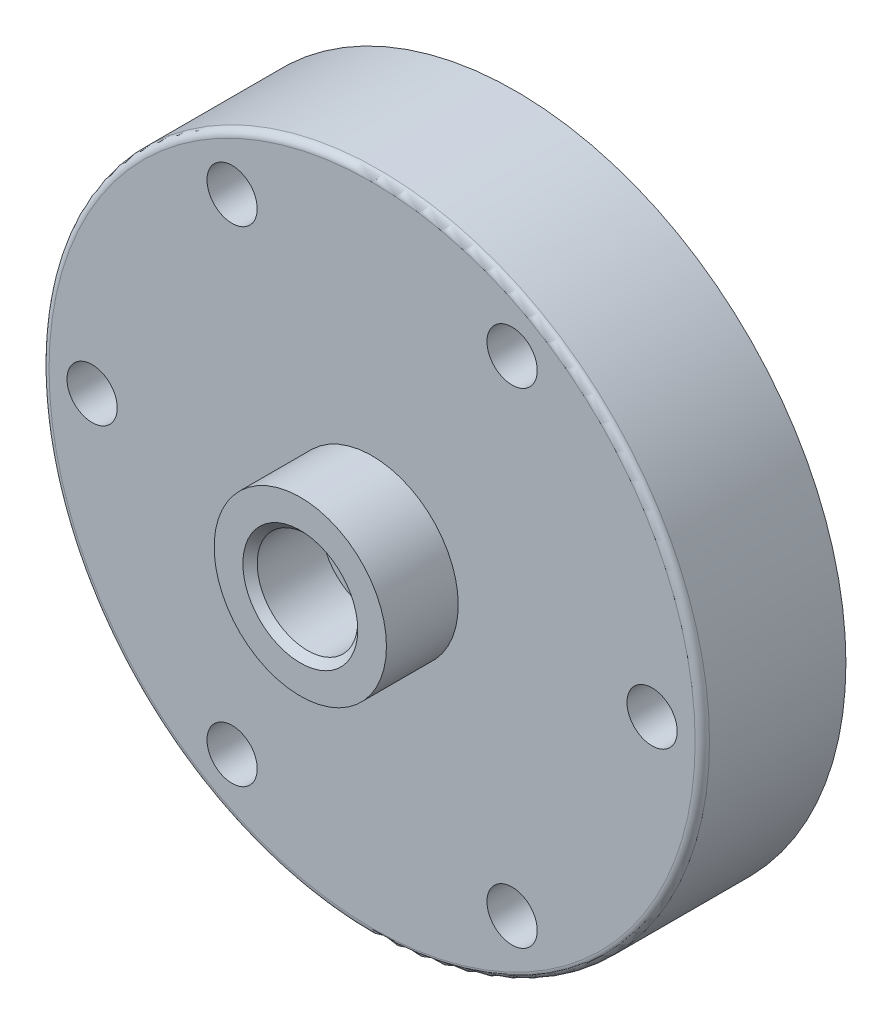
ISO-10303-21;
HEADER;
FILE_DESCRIPTION(('STEP AP214'),'2;1');
FILE_NAME('part.step','',(''),(''),'','','');
FILE_SCHEMA(('AUTOMOTIVE_DESIGN { 1 0 10303 214 1 1 1 1 }'));
ENDSEC;
DATA;
#1=APPLICATION_CONTEXT('core data for automotive mechanical design processes');
#2=APPLICATION_PROTOCOL_DEFINITION('international standard','automotive_design',2000,#1);
#3=PRODUCT_CONTEXT('',#1,'mechanical');
#4=PRODUCT('Part','Part','',(#3));
#5=PRODUCT_RELATED_PRODUCT_CATEGORY('part','',(#4));
#6=PRODUCT_DEFINITION_FORMATION('','',#4);
#7=PRODUCT_DEFINITION_CONTEXT('part definition',#1,'design');
#8=PRODUCT_DEFINITION('design','',#6,#7);
#9=PRODUCT_DEFINITION_SHAPE('','',#8);
#10=(LENGTH_UNIT() NAMED_UNIT(*) SI_UNIT(.MILLI.,.METRE.));
#11=(NAMED_UNIT(*) PLANE_ANGLE_UNIT() SI_UNIT($,.RADIAN.));
#12=(NAMED_UNIT(*) SI_UNIT($,.STERADIAN.) SOLID_ANGLE_UNIT());
#13=UNCERTAINTY_MEASURE_WITH_UNIT(LENGTH_MEASURE(1.E-05),#10,'distance_accuracy_value','');
#14=(GEOMETRIC_REPRESENTATION_CONTEXT(3) GLOBAL_UNCERTAINTY_ASSIGNED_CONTEXT((#13)) GLOBAL_UNIT_ASSIGNED_CONTEXT((#10,
#11,#12)) REPRESENTATION_CONTEXT('',''));
#15=CARTESIAN_POINT('',(0.,0.,0.));
#16=DIRECTION('',(0.,0.,1.));
#17=DIRECTION('',(1.,0.,0.));
#18=AXIS2_PLACEMENT_3D('',#15,#16,#17);
#19=CARTESIAN_POINT('',(0.,0.,10.));
#20=DIRECTION('',(0.,0.,-1.));
#21=DIRECTION('',(-1.,0.,0.));
#22=AXIS2_PLACEMENT_3D('',#19,#20,#21);
#23=CYLINDRICAL_SURFACE('',#22,46.);
#24=CARTESIAN_POINT('',(0.,-46.,2.));
#25=CARTESIAN_POINT('',(0.224227383894109,-45.9999977285705,1.99999022232442));
#26=CARTESIAN_POINT('',(0.448606525183141,-45.9983430362557,1.98108234815376));
#27=CARTESIAN_POINT('',(0.891154156323271,-45.9919012379841,1.905934927026));
#28=CARTESIAN_POINT('',(1.10931535995352,-45.9871106030481,1.84965332115009));
#29=CARTESIAN_POINT('',(1.53295378380859,-45.9749381658736,1.70140050012005));
#30=CARTESIAN_POINT('',(1.73843820070689,-45.9675578500262,1.60944975468258));
#31=CARTESIAN_POINT('',(2.13100809888229,-45.9510332255131,1.39250606728456));
#32=CARTESIAN_POINT('',(2.31809744825638,-45.9418892889027,1.26752009241515));
#33=CARTESIAN_POINT('',(2.66913129878992,-45.9228348976703,0.987681719815504));
#34=CARTESIAN_POINT('',(2.83301797480505,-45.9129226200477,0.83275690290598));
#35=CARTESIAN_POINT('',(3.13249799915954,-45.8934639727461,0.497591975411362));
#36=CARTESIAN_POINT('',(3.26809009164363,-45.883917619324,0.317350741750759));
#37=CARTESIAN_POINT('',(3.50732983244712,-45.8662523263715,-0.0636835035145853));
#38=CARTESIAN_POINT('',(3.61092631199781,-45.8581356821084,-0.264508757951698));
#39=CARTESIAN_POINT('',(3.78290727978104,-45.8442700926442,-0.680785885197834));
#40=CARTESIAN_POINT('',(3.85129243978993,-45.8385211022726,-0.896237478870646));
#41=CARTESIAN_POINT('',(3.95074097738121,-45.830057344427,-1.33506953277858));
#42=CARTESIAN_POINT('',(3.98189897039565,-45.8273348860433,-1.55842840039361));
#43=CARTESIAN_POINT('',(4.00630104440279,-45.8252082353394,-2.00722090759731));
#44=CARTESIAN_POINT('',(3.99954589438519,-45.8258039757165,-2.23265450501178));
#45=CARTESIAN_POINT('',(3.9483915880778,-45.8302394140666,-2.67854807492503));
#46=CARTESIAN_POINT('',(3.90409535607296,-45.8340702424775,-2.8990199557931));
#47=CARTESIAN_POINT('',(3.77927624600677,-45.8445303189289,-3.32938773230792));
#48=CARTESIAN_POINT('',(3.69875298659973,-45.8511595964273,-3.53928351659897));
#49=CARTESIAN_POINT('',(3.50365067255338,-45.866479827065,-3.94286835048831));
#50=CARTESIAN_POINT('',(3.38902554426596,-45.8751735661868,-4.13653501696301));
#51=CARTESIAN_POINT('',(3.12900647092458,-45.8936406284605,-4.50191932139753));
#52=CARTESIAN_POINT('',(2.98361184659911,-45.9034139754438,-4.6736364746627));
#53=CARTESIAN_POINT('',(2.66560421524801,-45.9229785147518,-4.99084571117663));
#54=CARTESIAN_POINT('',(2.4929022472207,-45.9327696582409,-5.13624862745731));
#55=CARTESIAN_POINT('',(2.12549237013379,-45.95123564835,-5.39601217247962));
#56=CARTESIAN_POINT('',(1.93078444459427,-45.959910494134,-5.51037277797394));
#57=CARTESIAN_POINT('',(1.52483096588586,-45.9751683502548,-5.70480027159302));
#58=CARTESIAN_POINT('',(1.31358345578605,-45.9817511125928,-5.78486309439759));
#59=CARTESIAN_POINT('',(0.880574461427622,-45.9920803344126,-5.90835931460942));
#60=CARTESIAN_POINT('',(0.65881321489861,-45.995826857993,-5.95179353982128));
#61=CARTESIAN_POINT('',(0.211844479152889,-46.0000532442106,-6.00068756432463));
#62=CARTESIAN_POINT('',(-0.013349444017314,-46.0005436994455,-6.00627050217401));
#63=CARTESIAN_POINT('',(-0.461469996673726,-45.9982310016282,-5.97962622260013));
#64=CARTESIAN_POINT('',(-0.684396649193821,-45.9954278820702,-5.94739938968553));
#65=CARTESIAN_POINT('',(-1.12130261089924,-45.9868500316988,-5.84615245126864));
#66=CARTESIAN_POINT('',(-1.33529527230571,-45.9810799206281,-5.77718953954904));
#67=CARTESIAN_POINT('',(-1.74867267660003,-45.967216103292,-5.60448653639731));
#68=CARTESIAN_POINT('',(-1.9480571686755,-45.9591223571432,-5.50074584802472));
#69=CARTESIAN_POINT('',(-2.32711808841676,-45.9414917704405,-5.26112348293099));
#70=CARTESIAN_POINT('',(-2.50674286157891,-45.9319512956969,-5.12516036501805));
#71=CARTESIAN_POINT('',(-2.84066374135941,-45.9125109361372,-4.82507010303266));
#72=CARTESIAN_POINT('',(-2.99495936860324,-45.9026110445232,-4.66094242604343));
#73=CARTESIAN_POINT('',(-3.27426550151283,-45.8835361672919,-4.30864708293595));
#74=CARTESIAN_POINT('',(-3.39919555788599,-45.8743632176725,-4.12041550959438));
#75=CARTESIAN_POINT('',(-3.61567234236893,-45.8578101371487,-3.7255730943939));
#76=CARTESIAN_POINT('',(-3.70721942907557,-45.8504299869865,-3.51896244999094));
#77=CARTESIAN_POINT('',(-3.85419502490978,-45.8383098416306,-3.09350985635043));
#78=CARTESIAN_POINT('',(-3.90967250193944,-45.8335662683104,-2.87468492952759));
#79=CARTESIAN_POINT('',(-3.98309339935581,-45.8272445862578,-2.43078296645951));
#80=CARTESIAN_POINT('',(-4.00103761191455,-45.825666410717,-2.20570606226926));
#81=CARTESIAN_POINT('',(-3.99887309501891,-45.8258552825946,-1.75648876328429));
#82=CARTESIAN_POINT('',(-3.97889076180226,-45.8276112185648,-1.53234774397545));
#83=CARTESIAN_POINT('',(-3.90170423350695,-45.834246839158,-1.09061829859628));
#84=CARTESIAN_POINT('',(-3.84449998433456,-45.8391265283207,-0.873029882049171));
#85=CARTESIAN_POINT('',(-3.69452606310881,-45.8514568827458,-0.450575854024288));
#86=CARTESIAN_POINT('',(-3.6017589707124,-45.8589073615243,-0.245709320978924));
#87=CARTESIAN_POINT('',(-3.38330655214035,-45.8755401471554,0.145563118422641));
#88=CARTESIAN_POINT('',(-3.25762167508082,-45.8847224303796,0.331969276596446));
#89=CARTESIAN_POINT('',(-2.97642627183586,-45.9038206784499,0.681676773609639));
#90=CARTESIAN_POINT('',(-2.82082198308656,-45.9137388879215,0.844902596792356));
#91=CARTESIAN_POINT('',(-2.48437904881077,-45.93317092391,1.14298868566685));
#92=CARTESIAN_POINT('',(-2.303534319391,-45.9426846522082,1.27784209283288));
#93=CARTESIAN_POINT('',(-1.92136583977714,-45.9602544666636,1.51555314998078));
#94=CARTESIAN_POINT('',(-1.72000201971635,-45.9683076119567,1.61834654040367));
#95=CARTESIAN_POINT('',(-1.30293824908928,-45.9820150223571,1.78853082610918));
#96=CARTESIAN_POINT('',(-1.08725503492918,-45.9876720328809,1.8559622592335));
#97=CARTESIAN_POINT('',(-0.725257992711598,-45.994503746574,1.93640740059838));
#98=CARTESIAN_POINT('',(-0.581269530602111,-45.9965554127388,1.96022275096634));
#99=CARTESIAN_POINT('',(-0.291542097632153,-45.9993042759584,1.99202220637874));
#100=CARTESIAN_POINT('',(-0.145803131912244,-46.0000014769897,2.00000635790195));
#101=CARTESIAN_POINT('',(0.,-46.,2.));
#102=B_SPLINE_CURVE_WITH_KNOTS('',3,(#24,#25,#26,#27,#28,#29,#30,#31,#32,#33,#34,#35,#36,#37,
#38,#39,#40,#41,#42,#43,#44,#45,#46,#47,#48,#49,#50,#51,#52,#53,#54,#55,#56,#57,#58,#59,#60,#61,
#62,#63,#64,#65,#66,#67,#68,#69,#70,#71,#72,#73,#74,#75,#76,#77,#78,#79,#80,#81,#82,#83,#84,#85,
#86,#87,#88,#89,#90,#91,#92,#93,#94,#95,#96,#97,#98,#99,#100,#101),.UNSPECIFIED.,.T.,.F.,(4,2,2,
2,2,2,2,2,2,2,2,2,2,2,2,2,2,2,2,2,2,2,2,2,2,2,2,2,2,2,2,2,2,2,2,2,2,2,4),(0.,0.672149795371173,
1.34505728632151,2.01757918073403,2.68995935408334,3.36398678235651,4.03804412098098,
4.71317392514569,5.38829084842312,6.06168824011353,6.73507197338011,7.40661547829384,
8.07816605241074,8.75062808366532,9.42310496183092,10.0978195498406,10.7725346431367,
11.4473296883784,12.1221094828746,12.7946930125715,13.4672697024505,14.1388023163357,
14.8103464572807,15.4836063550193,16.1568789932759,16.8319751599037,17.507064074496,
18.1812345677475,18.855390831904,19.5273043074988,20.1992187595716,20.8710844815444,
21.5429410373477,22.2169384480893,22.8910985989687,23.5666014469276,24.2413282173606,
24.6783927333046,25.11545596607),.UNSPECIFIED.);
#103=CARTESIAN_POINT('',(0.,-46.,2.));
#104=VERTEX_POINT('',#103);
#105=EDGE_CURVE('E153',#104,#104,#102,.T.);
#106=ORIENTED_EDGE('',*,*,#105,.T.);
#107=EDGE_LOOP('',(#106));
#108=FACE_BOUND('',#107,.T.);
#109=CARTESIAN_POINT('',(0.,0.,9.));
#110=DIRECTION('',(0.,0.,1.));
#111=DIRECTION('',(1.,0.,0.));
#112=AXIS2_PLACEMENT_3D('',#109,#110,#111);
#113=CIRCLE('',#112,46.);
#114=CARTESIAN_POINT('',(46.,0.,9.));
#115=VERTEX_POINT('',#114);
#116=EDGE_CURVE('E63',#115,#115,#113,.F.);
#117=ORIENTED_EDGE('',*,*,#116,.T.);
#118=EDGE_LOOP('',(#117));
#119=FACE_BOUND('',#118,.T.);
#120=CARTESIAN_POINT('',(0.,0.,-10.));
#121=DIRECTION('',(0.,0.,1.));
#122=DIRECTION('',(1.,0.,0.));
#123=AXIS2_PLACEMENT_3D('',#120,#121,#122);
#124=CIRCLE('',#123,46.);
#125=CARTESIAN_POINT('',(46.,0.,-10.));
#126=VERTEX_POINT('',#125);
#127=EDGE_CURVE('E80',#126,#126,#124,.T.);
#128=ORIENTED_EDGE('',*,*,#127,.T.);
#129=EDGE_LOOP('',(#128));
#130=FACE_BOUND('',#129,.T.);
#131=ADVANCED_FACE('F43',(#108,#119,#130),#23,.T.);
#132=CARTESIAN_POINT('',(0.,0.,10.));
#133=DIRECTION('',(0.,0.,1.));
#134=DIRECTION('',(1.,0.,0.));
#135=AXIS2_PLACEMENT_3D('',#132,#133,#134);
#136=PLANE('',#135);
#137=CARTESIAN_POINT('',(0.,0.,10.));
#138=DIRECTION('',(0.,0.,1.));
#139=DIRECTION('',(1.,0.,0.));
#140=AXIS2_PLACEMENT_3D('',#137,#138,#139);
#141=CIRCLE('',#140,45.);
#142=CARTESIAN_POINT('',(45.,0.,10.));
#143=VERTEX_POINT('',#142);
#144=EDGE_CURVE('E75',#143,#143,#141,.T.);
#145=ORIENTED_EDGE('',*,*,#144,.T.);
#146=EDGE_LOOP('',(#145));
#147=FACE_BOUND('',#146,.T.);
#148=CARTESIAN_POINT('',(39.,0.,10.));
#149=DIRECTION('',(0.,0.,1.));
#150=DIRECTION('',(1.,0.,0.));
#151=AXIS2_PLACEMENT_3D('',#148,#149,#150);
#152=CIRCLE('',#151,3.5);
#153=CARTESIAN_POINT('',(42.5,0.,10.));
#154=VERTEX_POINT('',#153);
#155=EDGE_CURVE('E125',#154,#154,#152,.T.);
#156=ORIENTED_EDGE('',*,*,#155,.F.);
#157=EDGE_LOOP('',(#156));
#158=FACE_BOUND('',#157,.T.);
#159=CARTESIAN_POINT('',(19.5,33.7749907475931,10.));
#160=DIRECTION('',(0.,0.,1.));
#161=DIRECTION('',(1.,0.,0.));
#162=AXIS2_PLACEMENT_3D('',#159,#160,#161);
#163=CIRCLE('',#162,3.49999999999999);
#164=CARTESIAN_POINT('',(23.,33.7749907475931,10.));
#165=VERTEX_POINT('',#164);
#166=EDGE_CURVE('E126',#165,#165,#163,.T.);
#167=ORIENTED_EDGE('',*,*,#166,.F.);
#168=EDGE_LOOP('',(#167));
#169=FACE_BOUND('',#168,.T.);
#170=CARTESIAN_POINT('',(-19.5,33.7749907475931,10.));
#171=DIRECTION('',(0.,0.,1.));
#172=DIRECTION('',(1.,0.,0.));
#173=AXIS2_PLACEMENT_3D('',#170,#171,#172);
#174=CIRCLE('',#173,3.5);
#175=CARTESIAN_POINT('',(-16.,33.7749907475931,10.));
#176=VERTEX_POINT('',#175);
#177=EDGE_CURVE('E92',#176,#176,#174,.T.);
#178=ORIENTED_EDGE('',*,*,#177,.F.);
#179=EDGE_LOOP('',(#178));
#180=FACE_BOUND('',#179,.T.);
#181=CARTESIAN_POINT('',(-39.,0.,10.));
#182=DIRECTION('',(0.,0.,1.));
#183=DIRECTION('',(1.,0.,0.));
#184=AXIS2_PLACEMENT_3D('',#181,#182,#183);
#185=CIRCLE('',#184,3.5);
#186=CARTESIAN_POINT('',(-35.5,0.,10.));
#187=VERTEX_POINT('',#186);
#188=EDGE_CURVE('E101',#187,#187,#185,.T.);
#189=ORIENTED_EDGE('',*,*,#188,.F.);
#190=EDGE_LOOP('',(#189));
#191=FACE_BOUND('',#190,.T.);
#192=CARTESIAN_POINT('',(-19.5,-33.7749907475931,10.));
#193=DIRECTION('',(0.,0.,1.));
#194=DIRECTION('',(1.,0.,0.));
#195=AXIS2_PLACEMENT_3D('',#192,#193,#194);
#196=CIRCLE('',#195,3.5);
#197=CARTESIAN_POINT('',(-16.,-33.7749907475931,10.));
#198=VERTEX_POINT('',#197);
#199=EDGE_CURVE('E109',#198,#198,#196,.T.);
#200=ORIENTED_EDGE('',*,*,#199,.F.);
#201=EDGE_LOOP('',(#200));
#202=FACE_BOUND('',#201,.T.);
#203=CARTESIAN_POINT('',(19.5,-33.7749907475931,10.));
#204=DIRECTION('',(0.,0.,1.));
#205=DIRECTION('',(1.,0.,0.));
#206=AXIS2_PLACEMENT_3D('',#203,#204,#205);
#207=CIRCLE('',#206,3.5);
#208=CARTESIAN_POINT('',(23.,-33.7749907475931,10.));
#209=VERTEX_POINT('',#208);
#210=EDGE_CURVE('E117',#209,#209,#207,.T.);
#211=ORIENTED_EDGE('',*,*,#210,.F.);
#212=EDGE_LOOP('',(#211));
#213=FACE_BOUND('',#212,.T.);
#214=CARTESIAN_POINT('',(0.,0.,10.));
#215=DIRECTION('',(0.,0.,1.));
#216=DIRECTION('',(1.,0.,0.));
#217=AXIS2_PLACEMENT_3D('',#214,#215,#216);
#218=CIRCLE('',#217,12.);
#219=CARTESIAN_POINT('',(12.,0.,10.));
#220=VERTEX_POINT('',#219);
#221=EDGE_CURVE('E79',#220,#220,#218,.T.);
#222=ORIENTED_EDGE('',*,*,#221,.F.);
#223=EDGE_LOOP('',(#222));
#224=FACE_BOUND('',#223,.T.);
#225=ADVANCED_FACE('F221',(#147,#158,#169,#180,#191,#202,#213,#224),#136,.T.);
#226=CARTESIAN_POINT('',(0.,0.,-10.));
#227=DIRECTION('',(0.,0.,1.));
#228=DIRECTION('',(1.,0.,0.));
#229=AXIS2_PLACEMENT_3D('',#226,#227,#228);
#230=PLANE('',#229);
#231=CARTESIAN_POINT('',(0.,0.,-10.));
#232=DIRECTION('',(0.,0.,-1.));
#233=DIRECTION('',(-1.,0.,0.));
#234=AXIS2_PLACEMENT_3D('',#231,#232,#233);
#235=CIRCLE('',#234,33.);
#236=CARTESIAN_POINT('',(-33.,0.,-10.));
#237=VERTEX_POINT('',#236);
#238=EDGE_CURVE('E140',#237,#237,#235,.T.);
#239=ORIENTED_EDGE('',*,*,#238,.F.);
#240=EDGE_LOOP('',(#239));
#241=FACE_BOUND('',#240,.T.);
#242=CARTESIAN_POINT('',(39.,0.,-10.));
#243=DIRECTION('',(0.,0.,1.));
#244=DIRECTION('',(1.,0.,0.));
#245=AXIS2_PLACEMENT_3D('',#242,#243,#244);
#246=CIRCLE('',#245,3.5);
#247=CARTESIAN_POINT('',(42.5,0.,-10.));
#248=VERTEX_POINT('',#247);
#249=EDGE_CURVE('E91',#248,#248,#246,.T.);
#250=ORIENTED_EDGE('',*,*,#249,.T.);
#251=EDGE_LOOP('',(#250));
#252=FACE_BOUND('',#251,.T.);
#253=CARTESIAN_POINT('',(19.5,33.7749907475931,-10.));
#254=DIRECTION('',(0.,0.,1.));
#255=DIRECTION('',(1.,0.,0.));
#256=AXIS2_PLACEMENT_3D('',#253,#254,#255);
#257=CIRCLE('',#256,3.49999999999999);
#258=CARTESIAN_POINT('',(23.,33.7749907475931,-10.));
#259=VERTEX_POINT('',#258);
#260=EDGE_CURVE('E97',#259,#259,#257,.T.);
#261=ORIENTED_EDGE('',*,*,#260,.T.);
#262=EDGE_LOOP('',(#261));
#263=FACE_BOUND('',#262,.T.);
#264=CARTESIAN_POINT('',(-19.5,33.7749907475931,-10.));
#265=DIRECTION('',(0.,0.,1.));
#266=DIRECTION('',(1.,0.,0.));
#267=AXIS2_PLACEMENT_3D('',#264,#265,#266);
#268=CIRCLE('',#267,3.5);
#269=CARTESIAN_POINT('',(-16.,33.7749907475931,-10.));
#270=VERTEX_POINT('',#269);
#271=EDGE_CURVE('E96',#270,#270,#268,.T.);
#272=ORIENTED_EDGE('',*,*,#271,.T.);
#273=EDGE_LOOP('',(#272));
#274=FACE_BOUND('',#273,.T.);
#275=CARTESIAN_POINT('',(-39.,0.,-10.));
#276=DIRECTION('',(0.,0.,1.));
#277=DIRECTION('',(1.,0.,0.));
#278=AXIS2_PLACEMENT_3D('',#275,#276,#277);
#279=CIRCLE('',#278,3.5);
#280=CARTESIAN_POINT('',(-35.5,0.,-10.));
#281=VERTEX_POINT('',#280);
#282=EDGE_CURVE('E105',#281,#281,#279,.T.);
#283=ORIENTED_EDGE('',*,*,#282,.T.);
#284=EDGE_LOOP('',(#283));
#285=FACE_BOUND('',#284,.T.);
#286=CARTESIAN_POINT('',(-19.5,-33.7749907475931,-10.));
#287=DIRECTION('',(0.,0.,1.));
#288=DIRECTION('',(1.,0.,0.));
#289=AXIS2_PLACEMENT_3D('',#286,#287,#288);
#290=CIRCLE('',#289,3.5);
#291=CARTESIAN_POINT('',(-16.,-33.7749907475931,-10.));
#292=VERTEX_POINT('',#291);
#293=EDGE_CURVE('E113',#292,#292,#290,.T.);
#294=ORIENTED_EDGE('',*,*,#293,.T.);
#295=EDGE_LOOP('',(#294));
#296=FACE_BOUND('',#295,.T.);
#297=CARTESIAN_POINT('',(19.5,-33.7749907475931,-10.));
#298=DIRECTION('',(0.,0.,1.));
#299=DIRECTION('',(1.,0.,0.));
#300=AXIS2_PLACEMENT_3D('',#297,#298,#299);
#301=CIRCLE('',#300,3.5);
#302=CARTESIAN_POINT('',(23.,-33.7749907475931,-10.));
#303=VERTEX_POINT('',#302);
#304=EDGE_CURVE('E121',#303,#303,#301,.T.);
#305=ORIENTED_EDGE('',*,*,#304,.T.);
#306=EDGE_LOOP('',(#305));
#307=FACE_BOUND('',#306,.T.);
#308=ORIENTED_EDGE('',*,*,#127,.F.);
#309=EDGE_LOOP('',(#308));
#310=FACE_BOUND('',#309,.T.);
#311=ADVANCED_FACE('F219',(#241,#252,#263,#274,#285,#296,#307,#310),#230,.F.);
#312=CARTESIAN_POINT('',(0.,0.,20.));
#313=DIRECTION('',(0.,0.,-1.));
#314=DIRECTION('',(-1.,0.,0.));
#315=AXIS2_PLACEMENT_3D('',#312,#313,#314);
#316=CYLINDRICAL_SURFACE('',#315,12.);
#317=CARTESIAN_POINT('',(0.,0.,20.));
#318=DIRECTION('',(0.,0.,1.));
#319=DIRECTION('',(1.,0.,0.));
#320=AXIS2_PLACEMENT_3D('',#317,#318,#319);
#321=CIRCLE('',#320,12.);
#322=CARTESIAN_POINT('',(12.,0.,20.));
#323=VERTEX_POINT('',#322);
#324=EDGE_CURVE('E84',#323,#323,#321,.T.);
#325=ORIENTED_EDGE('',*,*,#324,.F.);
#326=EDGE_LOOP('',(#325));
#327=FACE_BOUND('',#326,.T.);
#328=ORIENTED_EDGE('',*,*,#221,.T.);
#329=EDGE_LOOP('',(#328));
#330=FACE_BOUND('',#329,.T.);
#331=ADVANCED_FACE('F216',(#327,#330),#316,.T.);
#332=CARTESIAN_POINT('',(0.,0.,20.));
#333=DIRECTION('',(0.,0.,1.));
#334=DIRECTION('',(1.,0.,0.));
#335=AXIS2_PLACEMENT_3D('',#332,#333,#334);
#336=PLANE('',#335);
#337=CARTESIAN_POINT('',(0.,0.,20.));
#338=DIRECTION('',(0.,0.,1.));
#339=DIRECTION('',(1.,0.,0.));
#340=AXIS2_PLACEMENT_3D('',#337,#338,#339);
#341=CIRCLE('',#340,7.99999999999999);
#342=CARTESIAN_POINT('',(7.99999999999999,0.,20.));
#343=VERTEX_POINT('',#342);
#344=EDGE_CURVE('E10',#343,#343,#341,.F.);
#345=ORIENTED_EDGE('',*,*,#344,.T.);
#346=EDGE_LOOP('',(#345));
#347=FACE_BOUND('',#346,.T.);
#348=ORIENTED_EDGE('',*,*,#324,.T.);
#349=EDGE_LOOP('',(#348));
#350=FACE_BOUND('',#349,.T.);
#351=ADVANCED_FACE('F202',(#347,#350),#336,.T.);
#352=CARTESIAN_POINT('',(19.5,-33.7749907475931,-10.));
#353=DIRECTION('',(0.,0.,1.));
#354=DIRECTION('',(1.,0.,0.));
#355=AXIS2_PLACEMENT_3D('',#352,#353,#354);
#356=CYLINDRICAL_SURFACE('',#355,3.5);
#357=ORIENTED_EDGE('',*,*,#304,.F.);
#358=EDGE_LOOP('',(#357));
#359=FACE_BOUND('',#358,.T.);
#360=ORIENTED_EDGE('',*,*,#210,.T.);
#361=EDGE_LOOP('',(#360));
#362=FACE_BOUND('',#361,.T.);
#363=ADVANCED_FACE('F198',(#359,#362),#356,.F.);
#364=CARTESIAN_POINT('',(-19.5,-33.7749907475931,-10.));
#365=DIRECTION('',(0.,0.,1.));
#366=DIRECTION('',(1.,0.,0.));
#367=AXIS2_PLACEMENT_3D('',#364,#365,#366);
#368=CYLINDRICAL_SURFACE('',#367,3.5);
#369=ORIENTED_EDGE('',*,*,#293,.F.);
#370=EDGE_LOOP('',(#369));
#371=FACE_BOUND('',#370,.T.);
#372=ORIENTED_EDGE('',*,*,#199,.T.);
#373=EDGE_LOOP('',(#372));
#374=FACE_BOUND('',#373,.T.);
#375=ADVANCED_FACE('F201',(#371,#374),#368,.F.);
#376=CARTESIAN_POINT('',(-39.,0.,-10.));
#377=DIRECTION('',(0.,0.,1.));
#378=DIRECTION('',(1.,0.,0.));
#379=AXIS2_PLACEMENT_3D('',#376,#377,#378);
#380=CYLINDRICAL_SURFACE('',#379,3.5);
#381=ORIENTED_EDGE('',*,*,#282,.F.);
#382=EDGE_LOOP('',(#381));
#383=FACE_BOUND('',#382,.T.);
#384=ORIENTED_EDGE('',*,*,#188,.T.);
#385=EDGE_LOOP('',(#384));
#386=FACE_BOUND('',#385,.T.);
#387=ADVANCED_FACE('F206',(#383,#386),#380,.F.);
#388=CARTESIAN_POINT('',(-19.5,33.7749907475931,-10.));
#389=DIRECTION('',(0.,0.,1.));
#390=DIRECTION('',(1.,0.,0.));
#391=AXIS2_PLACEMENT_3D('',#388,#389,#390);
#392=CYLINDRICAL_SURFACE('',#391,3.5);
#393=ORIENTED_EDGE('',*,*,#271,.F.);
#394=EDGE_LOOP('',(#393));
#395=FACE_BOUND('',#394,.T.);
#396=ORIENTED_EDGE('',*,*,#177,.T.);
#397=EDGE_LOOP('',(#396));
#398=FACE_BOUND('',#397,.T.);
#399=ADVANCED_FACE('F196',(#395,#398),#392,.F.);
#400=CARTESIAN_POINT('',(19.5,33.7749907475931,-10.));
#401=DIRECTION('',(0.,0.,1.));
#402=DIRECTION('',(1.,0.,0.));
#403=AXIS2_PLACEMENT_3D('',#400,#401,#402);
#404=CYLINDRICAL_SURFACE('',#403,3.49999999999999);
#405=ORIENTED_EDGE('',*,*,#260,.F.);
#406=EDGE_LOOP('',(#405));
#407=FACE_BOUND('',#406,.T.);
#408=ORIENTED_EDGE('',*,*,#166,.T.);
#409=EDGE_LOOP('',(#408));
#410=FACE_BOUND('',#409,.T.);
#411=ADVANCED_FACE('F192',(#407,#410),#404,.F.);
#412=CARTESIAN_POINT('',(39.,0.,-10.));
#413=DIRECTION('',(0.,0.,1.));
#414=DIRECTION('',(1.,0.,0.));
#415=AXIS2_PLACEMENT_3D('',#412,#413,#414);
#416=CYLINDRICAL_SURFACE('',#415,3.5);
#417=ORIENTED_EDGE('',*,*,#249,.F.);
#418=EDGE_LOOP('',(#417));
#419=FACE_BOUND('',#418,.T.);
#420=ORIENTED_EDGE('',*,*,#155,.T.);
#421=EDGE_LOOP('',(#420));
#422=FACE_BOUND('',#421,.T.);
#423=ADVANCED_FACE('F189',(#419,#422),#416,.F.);
#424=CARTESIAN_POINT('',(0.,0.,9.));
#425=DIRECTION('',(0.,0.,1.));
#426=DIRECTION('',(1.,0.,0.));
#427=AXIS2_PLACEMENT_3D('',#424,#425,#426);
#428=TOROIDAL_SURFACE('',#427,45.,1.);
#429=ORIENTED_EDGE('',*,*,#116,.F.);
#430=EDGE_LOOP('',(#429));
#431=FACE_BOUND('',#430,.T.);
#432=ORIENTED_EDGE('',*,*,#144,.F.);
#433=EDGE_LOOP('',(#432));
#434=FACE_BOUND('',#433,.T.);
#435=ADVANCED_FACE('F187',(#431,#434),#428,.T.);
#436=CARTESIAN_POINT('',(0.,0.,4.));
#437=DIRECTION('',(0.,0.,-1.));
#438=DIRECTION('',(-1.,0.,0.));
#439=AXIS2_PLACEMENT_3D('',#436,#437,#438);
#440=CYLINDRICAL_SURFACE('',#439,33.);
#441=CARTESIAN_POINT('',(0.,-33.,2.));
#442=CARTESIAN_POINT('',(-0.223801305491505,-32.9999969558129,1.99999045899096));
#443=CARTESIAN_POINT('',(-0.447743808064034,-32.9976992481914,1.98115405199308));
#444=CARTESIAN_POINT('',(-0.889401067379154,-32.9887542393864,1.90630712033694));
#445=CARTESIAN_POINT('',(-1.10710900952551,-32.9821023551355,1.85025742526948));
#446=CARTESIAN_POINT('',(-1.52983902053619,-32.9651986138428,1.7026562596702));
#447=CARTESIAN_POINT('',(-1.73486938003849,-32.9549491394049,1.61112828144018));
#448=CARTESIAN_POINT('',(-2.12661939719003,-32.9319911781194,1.39521915649779));
#449=CARTESIAN_POINT('',(-2.31334227024487,-32.9192831242503,1.27084379310695));
#450=CARTESIAN_POINT('',(-2.66418599736213,-32.8927538711825,0.992079916163124));
#451=CARTESIAN_POINT('',(-2.82819817435391,-32.878927789439,0.83755507596394));
#452=CARTESIAN_POINT('',(-3.12802913113998,-32.8517602971756,0.503171118625335));
#453=CARTESIAN_POINT('',(-3.26384649699011,-32.8384189109904,0.323310731690127));
#454=CARTESIAN_POINT('',(-3.50383433976517,-32.8136830857066,-0.057341138300055));
#455=CARTESIAN_POINT('',(-3.60790351727114,-32.8022949283727,-0.25819693047698));
#456=CARTESIAN_POINT('',(-3.780793946818,-32.7828188539988,-0.67469534652229));
#457=CARTESIAN_POINT('',(-3.84961645749954,-32.7747308191154,-0.890337442067411));
#458=CARTESIAN_POINT('',(-3.94973087788411,-32.7628170518708,-1.32916196064259));
#459=CARTESIAN_POINT('',(-3.98120583640232,-32.7589705374767,-1.55230204850896));
#460=CARTESIAN_POINT('',(-4.00629801514827,-32.7559116064256,-2.00072790580982));
#461=CARTESIAN_POINT('',(-3.99991667002376,-32.756699014156,-2.22601359360906));
#462=CARTESIAN_POINT('',(-3.94962774321501,-32.762799944861,-2.67106222866995));
#463=CARTESIAN_POINT('',(-3.90592150171733,-32.768089183279,-2.89084830679436));
#464=CARTESIAN_POINT('',(-3.78253743967911,-32.7825599300818,-3.31994320453687));
#465=CARTESIAN_POINT('',(-3.70285893016407,-32.7917415130163,-3.52925182339559));
#466=CARTESIAN_POINT('',(-3.50957474054861,-32.8129900264165,-3.93207752991913));
#467=CARTESIAN_POINT('',(-3.3958812638873,-32.8250644072638,-4.12555208194208));
#468=CARTESIAN_POINT('',(-3.13785733178003,-32.850732200003,-4.49075163032366));
#469=CARTESIAN_POINT('',(-2.99352555831389,-32.8643256772326,-4.66247569049647));
#470=CARTESIAN_POINT('',(-2.67720480655516,-32.8916080277259,-4.98046850586896));
#471=CARTESIAN_POINT('',(-2.50504222708054,-32.9052969469684,-5.12656462424617));
#472=CARTESIAN_POINT('',(-2.13854549445852,-32.9311450368864,-5.3878112531788));
#473=CARTESIAN_POINT('',(-1.94421129524354,-32.9433042043832,-5.50296169943448));
#474=CARTESIAN_POINT('',(-1.53875686094017,-32.9647296973872,-5.69904724431887));
#475=CARTESIAN_POINT('',(-1.32763151276492,-32.9739951374587,-5.77997187305519));
#476=CARTESIAN_POINT('',(-0.894651824892179,-32.9885810461424,-5.90517332841146));
#477=CARTESIAN_POINT('',(-0.672797957791596,-32.9939016883567,-5.94945176776174));
#478=CARTESIAN_POINT('',(-0.226151933486935,-32.9999759911712,-5.99988097665195));
#479=CARTESIAN_POINT('',(-0.00138700690903779,-33.0007581450581,-6.00626962936926));
#480=CARTESIAN_POINT('',(0.446010291584771,-32.9977441874559,-5.98136519796166));
#481=CARTESIAN_POINT('',(0.668642706056812,-32.9939481675208,-5.95007286737918));
#482=CARTESIAN_POINT('',(1.10475588230675,-32.9822222101791,-5.85089232296216));
#483=CARTESIAN_POINT('',(1.31826273527194,-32.9743050498401,-5.78311719732447));
#484=CARTESIAN_POINT('',(1.73087951773984,-32.9552234751977,-5.61301229864613));
#485=CARTESIAN_POINT('',(1.92998898487312,-32.9440589566637,-5.51068141645152));
#486=CARTESIAN_POINT('',(2.30922359321616,-32.9196569881552,-5.27379187895764));
#487=CARTESIAN_POINT('',(2.48925172196374,-32.906409723139,-5.13907894538935));
#488=CARTESIAN_POINT('',(2.82422713425746,-32.8793557772651,-4.84146805674617));
#489=CARTESIAN_POINT('',(2.97917348331214,-32.8655490755878,-4.67856905198841));
#490=CARTESIAN_POINT('',(3.26042801276093,-32.8388447984184,-4.32816387146003));
#491=CARTESIAN_POINT('',(3.38657875976532,-32.8259524744074,-4.1405308727507));
#492=CARTESIAN_POINT('',(3.60557440484833,-32.8026220505424,-3.74660099055149));
#493=CARTESIAN_POINT('',(3.69841993672826,-32.7921839039865,-3.54030446232385));
#494=CARTESIAN_POINT('',(3.84791328409439,-32.7749790265264,-3.11541676644631));
#495=CARTESIAN_POINT('',(3.90465067137528,-32.7682032169821,-2.89685749714904));
#496=CARTESIAN_POINT('',(3.98060599705671,-32.7590638355554,-2.45322667554964));
#497=CARTESIAN_POINT('',(3.99982556853791,-32.756700071625,-2.22815540713549));
#498=CARTESIAN_POINT('',(4.00017094305597,-32.7566577714004,-1.77945549902022));
#499=CARTESIAN_POINT('',(3.98154406881712,-32.7589488163933,-1.55582701212454));
#500=CARTESIAN_POINT('',(3.9072481791262,-32.7678926835001,-1.11490368905094));
#501=CARTESIAN_POINT('',(3.85157915254933,-32.774545506924,-0.897608854775209));
#502=CARTESIAN_POINT('',(3.70485507452384,-32.7914540797342,-0.475548596681521));
#503=CARTESIAN_POINT('',(3.61381118527903,-32.801708692512,-0.270779244132982));
#504=CARTESIAN_POINT('',(3.39894620430538,-32.8246673606273,0.120614798400279));
#505=CARTESIAN_POINT('',(3.27512479904037,-32.8373714393952,0.307239314795644));
#506=CARTESIAN_POINT('',(2.99729981899745,-32.8638971137237,0.658311146402087));
#507=CARTESIAN_POINT('',(2.84311184344748,-32.8777252175622,0.822612051247065));
#508=CARTESIAN_POINT('',(2.50931322551061,-32.9048830148095,1.12310454820542));
#509=CARTESIAN_POINT('',(2.32969658335767,-32.9182125896517,1.25928948780281));
#510=CARTESIAN_POINT('',(1.94940530878861,-32.9429238054981,1.50009567412915));
#511=CARTESIAN_POINT('',(1.74865752905046,-32.9542982956795,1.60460207580122));
#512=CARTESIAN_POINT('',(1.33243874453323,-32.973744646265,1.77827310475446));
#513=CARTESIAN_POINT('',(1.11698413205549,-32.9818201158236,1.84747637467403));
#514=CARTESIAN_POINT('',(0.750330661783401,-32.9917981291329,1.93189651947271));
#515=CARTESIAN_POINT('',(0.601449563819607,-32.9948589536342,1.95739892387381));
#516=CARTESIAN_POINT('',(0.301733698669465,-32.9989609084954,1.9914538231813));
#517=CARTESIAN_POINT('',(0.150898944742466,-33.0000020525556,2.00000643306434));
#518=CARTESIAN_POINT('',(0.,-33.,2.));
#519=B_SPLINE_CURVE_WITH_KNOTS('',3,(#441,#442,#443,#444,#445,#446,#447,#448,#449,#450,#451,
#452,#453,#454,#455,#456,#457,#458,#459,#460,#461,#462,#463,#464,#465,#466,#467,#468,#469,#470,
#471,#472,#473,#474,#475,#476,#477,#478,#479,#480,#481,#482,#483,#484,#485,#486,#487,#488,#489,
#490,#491,#492,#493,#494,#495,#496,#497,#498,#499,#500,#501,#502,#503,#504,#505,#506,#507,#508,
#509,#510,#511,#512,#513,#514,#515,#516,#517,#518),.UNSPECIFIED.,.T.,.F.,(4,2,2,2,2,2,2,2,2,2,2,
2,2,2,2,2,2,2,2,2,2,2,2,2,2,2,2,2,2,2,2,2,2,2,2,2,2,2,4),(0.,0.670852757331524,1.34241277077982,
2.01352886155954,2.68452687001438,3.3586323428272,4.03277161325478,4.70903989932935,
5.38528403452137,6.05819987045583,6.73109020493021,7.40037355680564,8.06966972796498,
8.74070855650267,9.41177625812108,10.0872040092462,10.7626331637823,11.4382687871515,
12.1138746754781,12.7852343839394,13.4565806668056,14.1258578157652,14.7951564489015,
15.4677093371486,16.1402872774593,16.8164587195714,17.4926172933959,18.1670919460461,
18.8415372394158,19.5115892773189,20.1816415164576,20.8514824984184,21.5213298880329,
22.1953778372446,22.8695850905596,23.5462081117186,24.2220889067939,24.6744171880356,
25.1267424009587),.UNSPECIFIED.);
#520=CARTESIAN_POINT('',(0.,-33.,2.));
#521=VERTEX_POINT('',#520);
#522=EDGE_CURVE('E48',#521,#521,#519,.T.);
#523=ORIENTED_EDGE('',*,*,#522,.T.);
#524=EDGE_LOOP('',(#523));
#525=FACE_BOUND('',#524,.T.);
#526=CARTESIAN_POINT('',(0.,0.,4.));
#527=DIRECTION('',(0.,0.,-1.));
#528=DIRECTION('',(-1.,0.,0.));
#529=AXIS2_PLACEMENT_3D('',#526,#527,#528);
#530=CIRCLE('',#529,33.);
#531=CARTESIAN_POINT('',(-33.,0.,4.));
#532=VERTEX_POINT('',#531);
#533=EDGE_CURVE('E130',#532,#532,#530,.T.);
#534=ORIENTED_EDGE('',*,*,#533,.F.);
#535=EDGE_LOOP('',(#534));
#536=FACE_BOUND('',#535,.T.);
#537=ORIENTED_EDGE('',*,*,#238,.T.);
#538=EDGE_LOOP('',(#537));
#539=FACE_BOUND('',#538,.T.);
#540=ADVANCED_FACE('F182',(#525,#536,#539),#440,.F.);
#541=CARTESIAN_POINT('',(0.,0.,4.));
#542=DIRECTION('',(0.,0.,-1.));
#543=DIRECTION('',(-1.,0.,0.));
#544=AXIS2_PLACEMENT_3D('',#541,#542,#543);
#545=PLANE('',#544);
#546=CARTESIAN_POINT('',(0.,0.,4.));
#547=DIRECTION('',(0.,0.,-1.));
#548=DIRECTION('',(-1.,0.,0.));
#549=AXIS2_PLACEMENT_3D('',#546,#547,#548);
#550=CIRCLE('',#549,2.5);
#551=CARTESIAN_POINT('',(-2.5,0.,4.));
#552=VERTEX_POINT('',#551);
#553=EDGE_CURVE('E66',#552,#552,#550,.T.);
#554=ORIENTED_EDGE('',*,*,#553,.F.);
#555=EDGE_LOOP('',(#554));
#556=FACE_BOUND('',#555,.T.);
#557=ORIENTED_EDGE('',*,*,#533,.T.);
#558=EDGE_LOOP('',(#557));
#559=FACE_BOUND('',#558,.T.);
#560=ADVANCED_FACE('F179',(#556,#559),#545,.T.);
#561=CARTESIAN_POINT('',(0.,0.,10.));
#562=DIRECTION('',(0.,0.,1.));
#563=DIRECTION('',(1.,0.,0.));
#564=AXIS2_PLACEMENT_3D('',#561,#562,#563);
#565=CYLINDRICAL_SURFACE('',#564,7.);
#566=CARTESIAN_POINT('',(0.,0.,19.));
#567=DIRECTION('',(0.,0.,1.));
#568=DIRECTION('',(1.,0.,0.));
#569=AXIS2_PLACEMENT_3D('',#566,#567,#568);
#570=CIRCLE('',#569,7.);
#571=CARTESIAN_POINT('',(7.,0.,19.));
#572=VERTEX_POINT('',#571);
#573=EDGE_CURVE('E58',#572,#572,#570,.T.);
#574=ORIENTED_EDGE('',*,*,#573,.T.);
#575=EDGE_LOOP('',(#574));
#576=FACE_BOUND('',#575,.T.);
#577=CARTESIAN_POINT('',(0.,0.,10.));
#578=DIRECTION('',(0.,0.,1.));
#579=DIRECTION('',(1.,0.,0.));
#580=AXIS2_PLACEMENT_3D('',#577,#578,#579);
#581=CIRCLE('',#580,7.);
#582=CARTESIAN_POINT('',(7.,0.,10.));
#583=VERTEX_POINT('',#582);
#584=EDGE_CURVE('E70',#583,#583,#581,.T.);
#585=ORIENTED_EDGE('',*,*,#584,.F.);
#586=EDGE_LOOP('',(#585));
#587=FACE_BOUND('',#586,.T.);
#588=ADVANCED_FACE('F175',(#576,#587),#565,.F.);
#589=CARTESIAN_POINT('',(0.,0.,10.));
#590=DIRECTION('',(0.,0.,1.));
#591=DIRECTION('',(1.,0.,0.));
#592=AXIS2_PLACEMENT_3D('',#589,#590,#591);
#593=PLANE('',#592);
#594=CARTESIAN_POINT('',(0.,0.,10.));
#595=DIRECTION('',(0.,0.,1.));
#596=DIRECTION('',(1.,0.,0.));
#597=AXIS2_PLACEMENT_3D('',#594,#595,#596);
#598=CIRCLE('',#597,2.5);
#599=CARTESIAN_POINT('',(2.5,0.,10.));
#600=VERTEX_POINT('',#599);
#601=EDGE_CURVE('E71',#600,#600,#598,.T.);
#602=ORIENTED_EDGE('',*,*,#601,.F.);
#603=EDGE_LOOP('',(#602));
#604=FACE_BOUND('',#603,.T.);
#605=ORIENTED_EDGE('',*,*,#584,.T.);
#606=EDGE_LOOP('',(#605));
#607=FACE_BOUND('',#606,.T.);
#608=ADVANCED_FACE('F171',(#604,#607),#593,.T.);
#609=CARTESIAN_POINT('',(0.,0.,-10.));
#610=DIRECTION('',(0.,0.,1.));
#611=DIRECTION('',(1.,0.,0.));
#612=AXIS2_PLACEMENT_3D('',#609,#610,#611);
#613=CYLINDRICAL_SURFACE('',#612,2.5);
#614=ORIENTED_EDGE('',*,*,#553,.T.);
#615=EDGE_LOOP('',(#614));
#616=FACE_BOUND('',#615,.T.);
#617=ORIENTED_EDGE('',*,*,#601,.T.);
#618=EDGE_LOOP('',(#617));
#619=FACE_BOUND('',#618,.T.);
#620=ADVANCED_FACE('F167',(#616,#619),#613,.F.);
#621=CARTESIAN_POINT('',(0.,0.,19.));
#622=DIRECTION('',(0.,0.,1.));
#623=DIRECTION('',(1.,0.,0.));
#624=AXIS2_PLACEMENT_3D('',#621,#622,#623);
#625=CONICAL_SURFACE('',#624,7.,0.785398163397457);
#626=ORIENTED_EDGE('',*,*,#344,.F.);
#627=EDGE_LOOP('',(#626));
#628=FACE_BOUND('',#627,.T.);
#629=ORIENTED_EDGE('',*,*,#573,.F.);
#630=EDGE_LOOP('',(#629));
#631=FACE_BOUND('',#630,.T.);
#632=ADVANCED_FACE('F46',(#628,#631),#625,.F.);
#633=CARTESIAN_POINT('',(0.,-100.,-2.));
#634=DIRECTION('',(0.,1.,0.));
#635=DIRECTION('',(0.,0.,1.));
#636=AXIS2_PLACEMENT_3D('',#633,#634,#635);
#637=CYLINDRICAL_SURFACE('',#636,4.);
#638=ORIENTED_EDGE('',*,*,#522,.F.);
#639=EDGE_LOOP('',(#638));
#640=FACE_BOUND('',#639,.T.);
#641=ORIENTED_EDGE('',*,*,#105,.F.);
#642=EDGE_LOOP('',(#641));
#643=FACE_BOUND('',#642,.T.);
#644=ADVANCED_FACE('F162',(#640,#643),#637,.F.);
#645=CLOSED_SHELL('',(#131,#225,#311,#331,#351,#363,#375,#387,#399,#411,#423,#435,#540,#560,
#588,#608,#620,#632,#644));
#646=MANIFOLD_SOLID_BREP('B2',#645);
#647=ADVANCED_BREP_SHAPE_REPRESENTATION('',(#18,#646),#14);
#648=SHAPE_DEFINITION_REPRESENTATION(#9,#647);
ENDSEC;
END-ISO-10303-21;
